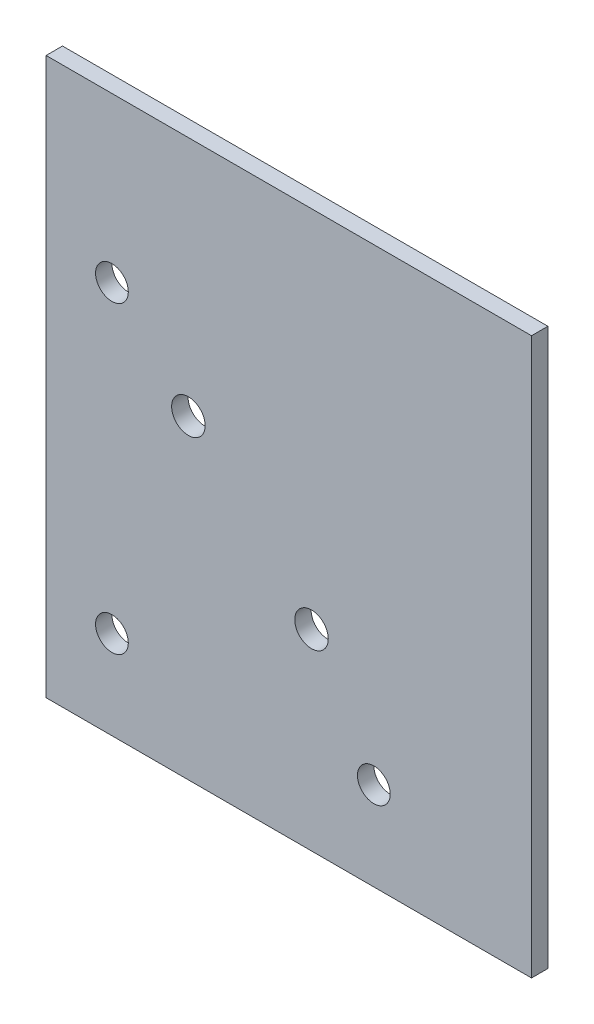
ISO-10303-21;
HEADER;
FILE_DESCRIPTION(('STEP AP214'),'2;1');
FILE_NAME('part.step','',(''),(''),'','','');
FILE_SCHEMA(('AUTOMOTIVE_DESIGN { 1 0 10303 214 1 1 1 1 }'));
ENDSEC;
DATA;
#1=APPLICATION_CONTEXT('core data for automotive mechanical design processes');
#2=APPLICATION_PROTOCOL_DEFINITION('international standard','automotive_design',2000,#1);
#3=PRODUCT_CONTEXT('',#1,'mechanical');
#4=PRODUCT('Part','Part','',(#3));
#5=PRODUCT_RELATED_PRODUCT_CATEGORY('part','',(#4));
#6=PRODUCT_DEFINITION_FORMATION('','',#4);
#7=PRODUCT_DEFINITION_CONTEXT('part definition',#1,'design');
#8=PRODUCT_DEFINITION('design','',#6,#7);
#9=PRODUCT_DEFINITION_SHAPE('','',#8);
#10=(LENGTH_UNIT() NAMED_UNIT(*) SI_UNIT(.MILLI.,.METRE.));
#11=(NAMED_UNIT(*) PLANE_ANGLE_UNIT() SI_UNIT($,.RADIAN.));
#12=(NAMED_UNIT(*) SI_UNIT($,.STERADIAN.) SOLID_ANGLE_UNIT());
#13=UNCERTAINTY_MEASURE_WITH_UNIT(LENGTH_MEASURE(1.E-05),#10,'distance_accuracy_value','');
#14=(GEOMETRIC_REPRESENTATION_CONTEXT(3) GLOBAL_UNCERTAINTY_ASSIGNED_CONTEXT((#13)) GLOBAL_UNIT_ASSIGNED_CONTEXT((#10,
#11,#12)) REPRESENTATION_CONTEXT('',''));
#15=CARTESIAN_POINT('',(0.,0.,0.));
#16=DIRECTION('',(0.,0.,1.));
#17=DIRECTION('',(1.,0.,0.));
#18=AXIS2_PLACEMENT_3D('',#15,#16,#17);
#19=CARTESIAN_POINT('',(0.,0.,3.175));
#20=DIRECTION('',(0.,0.,1.));
#21=DIRECTION('',(1.,0.,0.));
#22=AXIS2_PLACEMENT_3D('',#19,#20,#21);
#23=PLANE('',#22);
#24=CARTESIAN_POINT('',(-61.3674606904029,161.872667497816,3.175));
#25=DIRECTION('',(0.,0.,1.));
#26=DIRECTION('',(1.,0.,0.));
#27=AXIS2_PLACEMENT_3D('',#24,#25,#26);
#28=CIRCLE('',#27,3.25119999999999);
#29=CARTESIAN_POINT('',(-58.1162606904029,161.872667497816,3.175));
#30=VERTEX_POINT('',#29);
#31=EDGE_CURVE('E156',#30,#30,#28,.T.);
#32=ORIENTED_EDGE('',*,*,#31,.F.);
#33=EDGE_LOOP('',(#32));
#34=FACE_BOUND('',#33,.T.);
#35=CARTESIAN_POINT('',(-25.4000000000004,117.928571428571,3.175));
#36=DIRECTION('',(0.,0.,1.));
#37=DIRECTION('',(1.,0.,0.));
#38=AXIS2_PLACEMENT_3D('',#35,#36,#37);
#39=CIRCLE('',#38,3.175);
#40=CARTESIAN_POINT('',(-22.2250000000004,117.928571428571,3.175));
#41=VERTEX_POINT('',#40);
#42=EDGE_CURVE('E140',#41,#41,#39,.T.);
#43=ORIENTED_EDGE('',*,*,#42,.F.);
#44=EDGE_LOOP('',(#43));
#45=FACE_BOUND('',#44,.T.);
#46=DIRECTION('',(0.,1.,0.));
#47=VECTOR('',#46,1.);
#48=CARTESIAN_POINT('',(5.18327110159333,100.76040929178,3.175));
#49=LINE('',#48,#47);
#50=CARTESIAN_POINT('',(5.18327110159333,100.76040929178,3.175));
#51=VERTEX_POINT('',#50);
#52=CARTESIAN_POINT('',(5.18327110159333,208.650287830947,3.175));
#53=VERTEX_POINT('',#52);
#54=EDGE_CURVE('E98',#51,#53,#49,.T.);
#55=ORIENTED_EDGE('',*,*,#54,.T.);
#56=DIRECTION('',(-1.,0.,0.));
#57=VECTOR('',#56,1.);
#58=CARTESIAN_POINT('',(5.18327110159333,208.650287830947,3.175));
#59=LINE('',#58,#57);
#60=CARTESIAN_POINT('',(-88.9666501122157,208.650287830947,3.175));
#61=VERTEX_POINT('',#60);
#62=EDGE_CURVE('E93',#53,#61,#59,.T.);
#63=ORIENTED_EDGE('',*,*,#62,.T.);
#64=DIRECTION('',(0.,-1.,0.));
#65=VECTOR('',#64,1.);
#66=CARTESIAN_POINT('',(-88.9666501122157,100.76040929178,3.175));
#67=LINE('',#66,#65);
#68=CARTESIAN_POINT('',(-88.9666501122157,100.76040929178,3.175));
#69=VERTEX_POINT('',#68);
#70=EDGE_CURVE('E96',#61,#69,#67,.T.);
#71=ORIENTED_EDGE('',*,*,#70,.T.);
#72=DIRECTION('',(1.,0.,0.));
#73=VECTOR('',#72,1.);
#74=CARTESIAN_POINT('',(5.18327110159333,100.76040929178,3.175));
#75=LINE('',#74,#73);
#76=EDGE_CURVE('E63',#69,#51,#75,.T.);
#77=ORIENTED_EDGE('',*,*,#76,.T.);
#78=EDGE_LOOP('',(#55,#63,#71,#77));
#79=FACE_BOUND('',#78,.T.);
#80=CARTESIAN_POINT('',(-76.2000000000004,117.928571428571,3.175));
#81=DIRECTION('',(0.,0.,1.));
#82=DIRECTION('',(1.,0.,0.));
#83=AXIS2_PLACEMENT_3D('',#80,#81,#82);
#84=CIRCLE('',#83,3.175);
#85=CARTESIAN_POINT('',(-73.0250000000004,117.928571428571,3.175));
#86=VERTEX_POINT('',#85);
#87=EDGE_CURVE('E118',#86,#86,#84,.T.);
#88=ORIENTED_EDGE('',*,*,#87,.F.);
#89=EDGE_LOOP('',(#88));
#90=FACE_BOUND('',#89,.T.);
#91=CARTESIAN_POINT('',(-76.2000000000006,176.892857142857,3.175));
#92=DIRECTION('',(0.,0.,1.));
#93=DIRECTION('',(1.,0.,0.));
#94=AXIS2_PLACEMENT_3D('',#91,#92,#93);
#95=CIRCLE('',#94,3.17499999999998);
#96=CARTESIAN_POINT('',(-73.0250000000006,176.892857142857,3.175));
#97=VERTEX_POINT('',#96);
#98=EDGE_CURVE('E148',#97,#97,#95,.T.);
#99=ORIENTED_EDGE('',*,*,#98,.F.);
#100=EDGE_LOOP('',(#99));
#101=FACE_BOUND('',#100,.T.);
#102=CARTESIAN_POINT('',(-37.4914606904029,137.996667497816,3.175));
#103=DIRECTION('',(0.,0.,1.));
#104=DIRECTION('',(1.,0.,0.));
#105=AXIS2_PLACEMENT_3D('',#102,#103,#104);
#106=CIRCLE('',#105,3.25119999999999);
#107=CARTESIAN_POINT('',(-34.2402606904029,137.996667497816,3.175));
#108=VERTEX_POINT('',#107);
#109=EDGE_CURVE('E164',#108,#108,#106,.T.);
#110=ORIENTED_EDGE('',*,*,#109,.F.);
#111=EDGE_LOOP('',(#110));
#112=FACE_BOUND('',#111,.T.);
#113=ADVANCED_FACE('F45',(#34,#45,#79,#90,#101,#112),#23,.T.);
#114=CARTESIAN_POINT('',(0.,0.,0.));
#115=DIRECTION('',(0.,0.,1.));
#116=DIRECTION('',(1.,0.,0.));
#117=AXIS2_PLACEMENT_3D('',#114,#115,#116);
#118=PLANE('',#117);
#119=DIRECTION('',(0.,1.,0.));
#120=VECTOR('',#119,1.);
#121=CARTESIAN_POINT('',(5.18327110159333,100.76040929178,0.));
#122=LINE('',#121,#120);
#123=CARTESIAN_POINT('',(5.18327110159333,100.76040929178,0.));
#124=VERTEX_POINT('',#123);
#125=CARTESIAN_POINT('',(5.18327110159333,208.650287830947,0.));
#126=VERTEX_POINT('',#125);
#127=EDGE_CURVE('E114',#124,#126,#122,.T.);
#128=ORIENTED_EDGE('',*,*,#127,.F.);
#129=DIRECTION('',(1.,0.,0.));
#130=VECTOR('',#129,1.);
#131=CARTESIAN_POINT('',(5.18327110159333,100.76040929178,0.));
#132=LINE('',#131,#130);
#133=CARTESIAN_POINT('',(-88.9666501122157,100.76040929178,0.));
#134=VERTEX_POINT('',#133);
#135=EDGE_CURVE('E86',#134,#124,#132,.T.);
#136=ORIENTED_EDGE('',*,*,#135,.F.);
#137=DIRECTION('',(0.,-1.,0.));
#138=VECTOR('',#137,1.);
#139=CARTESIAN_POINT('',(-88.9666501122157,100.76040929178,0.));
#140=LINE('',#139,#138);
#141=CARTESIAN_POINT('',(-88.9666501122157,208.650287830947,0.));
#142=VERTEX_POINT('',#141);
#143=EDGE_CURVE('E80',#142,#134,#140,.T.);
#144=ORIENTED_EDGE('',*,*,#143,.F.);
#145=DIRECTION('',(-1.,0.,0.));
#146=VECTOR('',#145,1.);
#147=CARTESIAN_POINT('',(5.18327110159333,208.650287830947,0.));
#148=LINE('',#147,#146);
#149=EDGE_CURVE('E103',#126,#142,#148,.T.);
#150=ORIENTED_EDGE('',*,*,#149,.F.);
#151=EDGE_LOOP('',(#128,#136,#144,#150));
#152=FACE_BOUND('',#151,.T.);
#153=CARTESIAN_POINT('',(-76.2000000000004,117.928571428571,0.));
#154=DIRECTION('',(0.,0.,1.));
#155=DIRECTION('',(1.,0.,0.));
#156=AXIS2_PLACEMENT_3D('',#153,#154,#155);
#157=CIRCLE('',#156,3.175);
#158=CARTESIAN_POINT('',(-73.0250000000004,117.928571428571,0.));
#159=VERTEX_POINT('',#158);
#160=EDGE_CURVE('E136',#159,#159,#157,.T.);
#161=ORIENTED_EDGE('',*,*,#160,.T.);
#162=EDGE_LOOP('',(#161));
#163=FACE_BOUND('',#162,.T.);
#164=CARTESIAN_POINT('',(-25.4000000000004,117.928571428571,0.));
#165=DIRECTION('',(0.,0.,1.));
#166=DIRECTION('',(1.,0.,0.));
#167=AXIS2_PLACEMENT_3D('',#164,#165,#166);
#168=CIRCLE('',#167,3.175);
#169=CARTESIAN_POINT('',(-22.2250000000004,117.928571428571,0.));
#170=VERTEX_POINT('',#169);
#171=EDGE_CURVE('E144',#170,#170,#168,.T.);
#172=ORIENTED_EDGE('',*,*,#171,.T.);
#173=EDGE_LOOP('',(#172));
#174=FACE_BOUND('',#173,.T.);
#175=CARTESIAN_POINT('',(-76.2000000000006,176.892857142857,0.));
#176=DIRECTION('',(0.,0.,1.));
#177=DIRECTION('',(1.,0.,0.));
#178=AXIS2_PLACEMENT_3D('',#175,#176,#177);
#179=CIRCLE('',#178,3.17499999999998);
#180=CARTESIAN_POINT('',(-73.0250000000006,176.892857142857,0.));
#181=VERTEX_POINT('',#180);
#182=EDGE_CURVE('E152',#181,#181,#179,.T.);
#183=ORIENTED_EDGE('',*,*,#182,.T.);
#184=EDGE_LOOP('',(#183));
#185=FACE_BOUND('',#184,.T.);
#186=CARTESIAN_POINT('',(-61.3674606904029,161.872667497816,0.));
#187=DIRECTION('',(0.,0.,1.));
#188=DIRECTION('',(1.,0.,0.));
#189=AXIS2_PLACEMENT_3D('',#186,#187,#188);
#190=CIRCLE('',#189,3.25119999999999);
#191=CARTESIAN_POINT('',(-58.1162606904029,161.872667497816,0.));
#192=VERTEX_POINT('',#191);
#193=EDGE_CURVE('E160',#192,#192,#190,.T.);
#194=ORIENTED_EDGE('',*,*,#193,.T.);
#195=EDGE_LOOP('',(#194));
#196=FACE_BOUND('',#195,.T.);
#197=CARTESIAN_POINT('',(-37.4914606904029,137.996667497816,0.));
#198=DIRECTION('',(0.,0.,1.));
#199=DIRECTION('',(1.,0.,0.));
#200=AXIS2_PLACEMENT_3D('',#197,#198,#199);
#201=CIRCLE('',#200,3.25119999999999);
#202=CARTESIAN_POINT('',(-34.2402606904029,137.996667497816,0.));
#203=VERTEX_POINT('',#202);
#204=EDGE_CURVE('E168',#203,#203,#201,.T.);
#205=ORIENTED_EDGE('',*,*,#204,.T.);
#206=EDGE_LOOP('',(#205));
#207=FACE_BOUND('',#206,.T.);
#208=ADVANCED_FACE('F131',(#152,#163,#174,#185,#196,#207),#118,.F.);
#209=CARTESIAN_POINT('',(5.18327110159333,100.76040929178,3.175));
#210=DIRECTION('',(-1.,0.,0.));
#211=DIRECTION('',(0.,0.,1.));
#212=AXIS2_PLACEMENT_3D('',#209,#210,#211);
#213=PLANE('',#212);
#214=ORIENTED_EDGE('',*,*,#127,.T.);
#215=DIRECTION('',(0.,0.,-1.));
#216=VECTOR('',#215,1.);
#217=CARTESIAN_POINT('',(5.18327110159333,208.650287830947,3.175));
#218=LINE('',#217,#216);
#219=EDGE_CURVE('E11',#53,#126,#218,.T.);
#220=ORIENTED_EDGE('',*,*,#219,.F.);
#221=ORIENTED_EDGE('',*,*,#54,.F.);
#222=DIRECTION('',(0.,0.,-1.));
#223=VECTOR('',#222,1.);
#224=CARTESIAN_POINT('',(5.18327110159333,100.76040929178,3.175));
#225=LINE('',#224,#223);
#226=EDGE_CURVE('E110',#51,#124,#225,.T.);
#227=ORIENTED_EDGE('',*,*,#226,.T.);
#228=EDGE_LOOP('',(#214,#220,#221,#227));
#229=FACE_BOUND('',#228,.T.);
#230=ADVANCED_FACE('F47',(#229),#213,.F.);
#231=CARTESIAN_POINT('',(5.18327110159333,208.650287830947,3.175));
#232=DIRECTION('',(0.,-1.,0.));
#233=DIRECTION('',(0.,0.,-1.));
#234=AXIS2_PLACEMENT_3D('',#231,#232,#233);
#235=PLANE('',#234);
#236=ORIENTED_EDGE('',*,*,#149,.T.);
#237=DIRECTION('',(0.,0.,-1.));
#238=VECTOR('',#237,1.);
#239=CARTESIAN_POINT('',(-88.9666501122157,208.650287830947,3.175));
#240=LINE('',#239,#238);
#241=EDGE_CURVE('E55',#61,#142,#240,.T.);
#242=ORIENTED_EDGE('',*,*,#241,.F.);
#243=ORIENTED_EDGE('',*,*,#62,.F.);
#244=ORIENTED_EDGE('',*,*,#219,.T.);
#245=EDGE_LOOP('',(#236,#242,#243,#244));
#246=FACE_BOUND('',#245,.T.);
#247=ADVANCED_FACE('F102',(#246),#235,.F.);
#248=CARTESIAN_POINT('',(-88.9666501122157,100.76040929178,3.175));
#249=DIRECTION('',(1.,0.,0.));
#250=DIRECTION('',(0.,0.,-1.));
#251=AXIS2_PLACEMENT_3D('',#248,#249,#250);
#252=PLANE('',#251);
#253=ORIENTED_EDGE('',*,*,#143,.T.);
#254=DIRECTION('',(0.,0.,-1.));
#255=VECTOR('',#254,1.);
#256=CARTESIAN_POINT('',(-88.9666501122157,100.76040929178,3.175));
#257=LINE('',#256,#255);
#258=EDGE_CURVE('E105',#69,#134,#257,.T.);
#259=ORIENTED_EDGE('',*,*,#258,.F.);
#260=ORIENTED_EDGE('',*,*,#70,.F.);
#261=ORIENTED_EDGE('',*,*,#241,.T.);
#262=EDGE_LOOP('',(#253,#259,#260,#261));
#263=FACE_BOUND('',#262,.T.);
#264=ADVANCED_FACE('F106',(#263),#252,.F.);
#265=CARTESIAN_POINT('',(5.18327110159333,100.76040929178,3.175));
#266=DIRECTION('',(0.,1.,0.));
#267=DIRECTION('',(-1.,0.,0.));
#268=AXIS2_PLACEMENT_3D('',#265,#266,#267);
#269=PLANE('',#268);
#270=ORIENTED_EDGE('',*,*,#135,.T.);
#271=ORIENTED_EDGE('',*,*,#226,.F.);
#272=ORIENTED_EDGE('',*,*,#76,.F.);
#273=ORIENTED_EDGE('',*,*,#258,.T.);
#274=EDGE_LOOP('',(#270,#271,#272,#273));
#275=FACE_BOUND('',#274,.T.);
#276=ADVANCED_FACE('F128',(#275),#269,.F.);
#277=CARTESIAN_POINT('',(-76.2000000000004,117.928571428571,3.175));
#278=DIRECTION('',(0.,0.,-1.));
#279=DIRECTION('',(-1.,0.,0.));
#280=AXIS2_PLACEMENT_3D('',#277,#278,#279);
#281=CYLINDRICAL_SURFACE('',#280,3.175);
#282=ORIENTED_EDGE('',*,*,#87,.T.);
#283=EDGE_LOOP('',(#282));
#284=FACE_BOUND('',#283,.T.);
#285=ORIENTED_EDGE('',*,*,#160,.F.);
#286=EDGE_LOOP('',(#285));
#287=FACE_BOUND('',#286,.T.);
#288=ADVANCED_FACE('F189',(#284,#287),#281,.F.);
#289=CARTESIAN_POINT('',(-25.4000000000004,117.928571428571,3.175));
#290=DIRECTION('',(0.,0.,-1.));
#291=DIRECTION('',(-1.,0.,0.));
#292=AXIS2_PLACEMENT_3D('',#289,#290,#291);
#293=CYLINDRICAL_SURFACE('',#292,3.175);
#294=ORIENTED_EDGE('',*,*,#42,.T.);
#295=EDGE_LOOP('',(#294));
#296=FACE_BOUND('',#295,.T.);
#297=ORIENTED_EDGE('',*,*,#171,.F.);
#298=EDGE_LOOP('',(#297));
#299=FACE_BOUND('',#298,.T.);
#300=ADVANCED_FACE('F257',(#296,#299),#293,.F.);
#301=CARTESIAN_POINT('',(-76.2000000000006,176.892857142857,3.175));
#302=DIRECTION('',(0.,0.,-1.));
#303=DIRECTION('',(-1.,0.,0.));
#304=AXIS2_PLACEMENT_3D('',#301,#302,#303);
#305=CYLINDRICAL_SURFACE('',#304,3.17499999999998);
#306=ORIENTED_EDGE('',*,*,#98,.T.);
#307=EDGE_LOOP('',(#306));
#308=FACE_BOUND('',#307,.T.);
#309=ORIENTED_EDGE('',*,*,#182,.F.);
#310=EDGE_LOOP('',(#309));
#311=FACE_BOUND('',#310,.T.);
#312=ADVANCED_FACE('F268',(#308,#311),#305,.F.);
#313=CARTESIAN_POINT('',(-61.3674606904029,161.872667497816,3.175));
#314=DIRECTION('',(0.,0.,-1.));
#315=DIRECTION('',(-1.,0.,0.));
#316=AXIS2_PLACEMENT_3D('',#313,#314,#315);
#317=CYLINDRICAL_SURFACE('',#316,3.25119999999999);
#318=ORIENTED_EDGE('',*,*,#31,.T.);
#319=EDGE_LOOP('',(#318));
#320=FACE_BOUND('',#319,.T.);
#321=ORIENTED_EDGE('',*,*,#193,.F.);
#322=EDGE_LOOP('',(#321));
#323=FACE_BOUND('',#322,.T.);
#324=ADVANCED_FACE('F279',(#320,#323),#317,.F.);
#325=CARTESIAN_POINT('',(-37.4914606904029,137.996667497816,3.175));
#326=DIRECTION('',(0.,0.,-1.));
#327=DIRECTION('',(-1.,0.,0.));
#328=AXIS2_PLACEMENT_3D('',#325,#326,#327);
#329=CYLINDRICAL_SURFACE('',#328,3.25119999999999);
#330=ORIENTED_EDGE('',*,*,#109,.T.);
#331=EDGE_LOOP('',(#330));
#332=FACE_BOUND('',#331,.T.);
#333=ORIENTED_EDGE('',*,*,#204,.F.);
#334=EDGE_LOOP('',(#333));
#335=FACE_BOUND('',#334,.T.);
#336=ADVANCED_FACE('F176',(#332,#335),#329,.F.);
#337=CLOSED_SHELL('',(#113,#208,#230,#247,#264,#276,#288,#300,#312,#324,#336));
#338=MANIFOLD_SOLID_BREP('B2',#337);
#339=ADVANCED_BREP_SHAPE_REPRESENTATION('',(#18,#338),#14);
#340=SHAPE_DEFINITION_REPRESENTATION(#9,#339);
ENDSEC;
END-ISO-10303-21;
